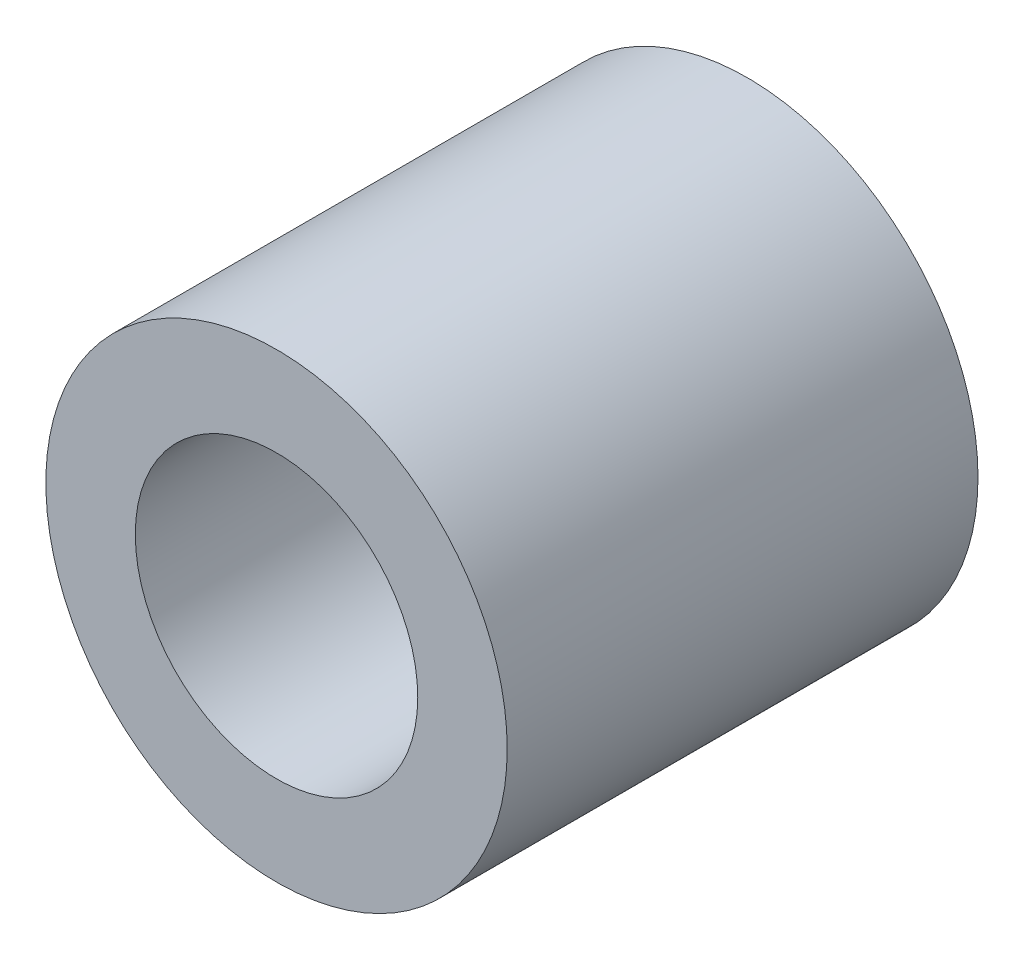
ISO-10303-21;
HEADER;
FILE_DESCRIPTION(('STEP AP214'),'2;1');
FILE_NAME('part.step','',(''),(''),'','','');
FILE_SCHEMA(('AUTOMOTIVE_DESIGN { 1 0 10303 214 1 1 1 1 }'));
ENDSEC;
DATA;
#1=APPLICATION_CONTEXT('core data for automotive mechanical design processes');
#2=APPLICATION_PROTOCOL_DEFINITION('international standard','automotive_design',2000,#1);
#3=PRODUCT_CONTEXT('',#1,'mechanical');
#4=PRODUCT('Part','Part','',(#3));
#5=PRODUCT_RELATED_PRODUCT_CATEGORY('part','',(#4));
#6=PRODUCT_DEFINITION_FORMATION('','',#4);
#7=PRODUCT_DEFINITION_CONTEXT('part definition',#1,'design');
#8=PRODUCT_DEFINITION('design','',#6,#7);
#9=PRODUCT_DEFINITION_SHAPE('','',#8);
#10=(LENGTH_UNIT() NAMED_UNIT(*) SI_UNIT(.MILLI.,.METRE.));
#11=(NAMED_UNIT(*) PLANE_ANGLE_UNIT() SI_UNIT($,.RADIAN.));
#12=(NAMED_UNIT(*) SI_UNIT($,.STERADIAN.) SOLID_ANGLE_UNIT());
#13=UNCERTAINTY_MEASURE_WITH_UNIT(LENGTH_MEASURE(1.E-05),#10,'distance_accuracy_value','');
#14=(GEOMETRIC_REPRESENTATION_CONTEXT(3) GLOBAL_UNCERTAINTY_ASSIGNED_CONTEXT((#13)) GLOBAL_UNIT_ASSIGNED_CONTEXT((#10,
#11,#12)) REPRESENTATION_CONTEXT('',''));
#15=CARTESIAN_POINT('',(0.,0.,0.));
#16=DIRECTION('',(0.,0.,1.));
#17=DIRECTION('',(1.,0.,0.));
#18=AXIS2_PLACEMENT_3D('',#15,#16,#17);
#19=CARTESIAN_POINT('',(24.4188287582101,6.,10.));
#20=DIRECTION('',(0.,0.,-1.));
#21=DIRECTION('',(-1.,0.,0.));
#22=AXIS2_PLACEMENT_3D('',#19,#20,#21);
#23=CYLINDRICAL_SURFACE('',#22,3.);
#24=CARTESIAN_POINT('',(24.4188287582101,6.,3.));
#25=DIRECTION('',(0.,0.,1.));
#26=DIRECTION('',(1.,0.,0.));
#27=AXIS2_PLACEMENT_3D('',#24,#25,#26);
#28=CIRCLE('',#27,3.);
#29=CARTESIAN_POINT('',(27.4188287582101,6.,3.));
#30=VERTEX_POINT('',#29);
#31=EDGE_CURVE('E10',#30,#30,#28,.T.);
#32=ORIENTED_EDGE('',*,*,#31,.F.);
#33=EDGE_LOOP('',(#32));
#34=FACE_BOUND('',#33,.T.);
#35=CARTESIAN_POINT('',(24.4188287582101,6.,10.));
#36=DIRECTION('',(0.,0.,1.));
#37=DIRECTION('',(1.,0.,0.));
#38=AXIS2_PLACEMENT_3D('',#35,#36,#37);
#39=CIRCLE('',#38,3.);
#40=CARTESIAN_POINT('',(27.4188287582101,6.,10.));
#41=VERTEX_POINT('',#40);
#42=EDGE_CURVE('E47',#41,#41,#39,.T.);
#43=ORIENTED_EDGE('',*,*,#42,.T.);
#44=EDGE_LOOP('',(#43));
#45=FACE_BOUND('',#44,.T.);
#46=ADVANCED_FACE('F37',(#34,#45),#23,.F.);
#47=CARTESIAN_POINT('',(24.4188287582101,6.,10.));
#48=DIRECTION('',(0.,0.,-1.));
#49=DIRECTION('',(-1.,0.,0.));
#50=AXIS2_PLACEMENT_3D('',#47,#48,#49);
#51=CYLINDRICAL_SURFACE('',#50,4.9);
#52=CARTESIAN_POINT('',(24.4188287582101,6.,10.));
#53=DIRECTION('',(0.,0.,1.));
#54=DIRECTION('',(1.,0.,0.));
#55=AXIS2_PLACEMENT_3D('',#52,#53,#54);
#56=CIRCLE('',#55,4.9);
#57=CARTESIAN_POINT('',(29.3188287582101,6.,10.));
#58=VERTEX_POINT('',#57);
#59=EDGE_CURVE('E43',#58,#58,#56,.T.);
#60=ORIENTED_EDGE('',*,*,#59,.F.);
#61=EDGE_LOOP('',(#60));
#62=FACE_BOUND('',#61,.T.);
#63=CARTESIAN_POINT('',(24.4188287582101,6.,0.));
#64=DIRECTION('',(0.,0.,1.));
#65=DIRECTION('',(1.,0.,0.));
#66=AXIS2_PLACEMENT_3D('',#63,#64,#65);
#67=CIRCLE('',#66,4.9);
#68=CARTESIAN_POINT('',(29.3188287582101,6.,0.));
#69=VERTEX_POINT('',#68);
#70=EDGE_CURVE('E52',#69,#69,#67,.T.);
#71=ORIENTED_EDGE('',*,*,#70,.T.);
#72=EDGE_LOOP('',(#71));
#73=FACE_BOUND('',#72,.T.);
#74=ADVANCED_FACE('F84',(#62,#73),#51,.T.);
#75=CARTESIAN_POINT('',(0.,0.,10.));
#76=DIRECTION('',(0.,0.,1.));
#77=DIRECTION('',(1.,0.,0.));
#78=AXIS2_PLACEMENT_3D('',#75,#76,#77);
#79=PLANE('',#78);
#80=ORIENTED_EDGE('',*,*,#42,.F.);
#81=EDGE_LOOP('',(#80));
#82=FACE_BOUND('',#81,.T.);
#83=ORIENTED_EDGE('',*,*,#59,.T.);
#84=EDGE_LOOP('',(#83));
#85=FACE_BOUND('',#84,.T.);
#86=ADVANCED_FACE('F79',(#82,#85),#79,.T.);
#87=CARTESIAN_POINT('',(0.,0.,0.));
#88=DIRECTION('',(0.,0.,1.));
#89=DIRECTION('',(1.,0.,0.));
#90=AXIS2_PLACEMENT_3D('',#87,#88,#89);
#91=PLANE('',#90);
#92=ORIENTED_EDGE('',*,*,#70,.F.);
#93=EDGE_LOOP('',(#92));
#94=FACE_BOUND('',#93,.T.);
#95=CARTESIAN_POINT('',(24.4188287582101,6.,0.));
#96=DIRECTION('',(0.,0.,1.));
#97=DIRECTION('',(1.,0.,0.));
#98=AXIS2_PLACEMENT_3D('',#95,#96,#97);
#99=CIRCLE('',#98,1.8);
#100=CARTESIAN_POINT('',(26.2188287582101,6.,0.));
#101=VERTEX_POINT('',#100);
#102=EDGE_CURVE('E60',#101,#101,#99,.T.);
#103=ORIENTED_EDGE('',*,*,#102,.T.);
#104=EDGE_LOOP('',(#103));
#105=FACE_BOUND('',#104,.T.);
#106=ADVANCED_FACE('F67',(#94,#105),#91,.F.);
#107=CARTESIAN_POINT('',(24.4188287582101,6.,3.));
#108=DIRECTION('',(0.,0.,-1.));
#109=DIRECTION('',(-1.,0.,0.));
#110=AXIS2_PLACEMENT_3D('',#107,#108,#109);
#111=CYLINDRICAL_SURFACE('',#110,1.8);
#112=CARTESIAN_POINT('',(24.4188287582101,6.,3.));
#113=DIRECTION('',(0.,0.,1.));
#114=DIRECTION('',(1.,0.,0.));
#115=AXIS2_PLACEMENT_3D('',#112,#113,#114);
#116=CIRCLE('',#115,1.8);
#117=CARTESIAN_POINT('',(26.2188287582101,6.,3.));
#118=VERTEX_POINT('',#117);
#119=EDGE_CURVE('E56',#118,#118,#116,.T.);
#120=ORIENTED_EDGE('',*,*,#119,.T.);
#121=EDGE_LOOP('',(#120));
#122=FACE_BOUND('',#121,.T.);
#123=ORIENTED_EDGE('',*,*,#102,.F.);
#124=EDGE_LOOP('',(#123));
#125=FACE_BOUND('',#124,.T.);
#126=ADVANCED_FACE('F69',(#122,#125),#111,.F.);
#127=CARTESIAN_POINT('',(0.,0.,3.));
#128=DIRECTION('',(0.,0.,1.));
#129=DIRECTION('',(1.,0.,0.));
#130=AXIS2_PLACEMENT_3D('',#127,#128,#129);
#131=PLANE('',#130);
#132=ORIENTED_EDGE('',*,*,#119,.F.);
#133=EDGE_LOOP('',(#132));
#134=FACE_BOUND('',#133,.T.);
#135=ORIENTED_EDGE('',*,*,#31,.T.);
#136=EDGE_LOOP('',(#135));
#137=FACE_BOUND('',#136,.T.);
#138=ADVANCED_FACE('F71',(#134,#137),#131,.T.);
#139=CLOSED_SHELL('',(#46,#74,#86,#106,#126,#138));
#140=MANIFOLD_SOLID_BREP('B2',#139);
#141=ADVANCED_BREP_SHAPE_REPRESENTATION('',(#18,#140),#14);
#142=SHAPE_DEFINITION_REPRESENTATION(#9,#141);
ENDSEC;
END-ISO-10303-21;
